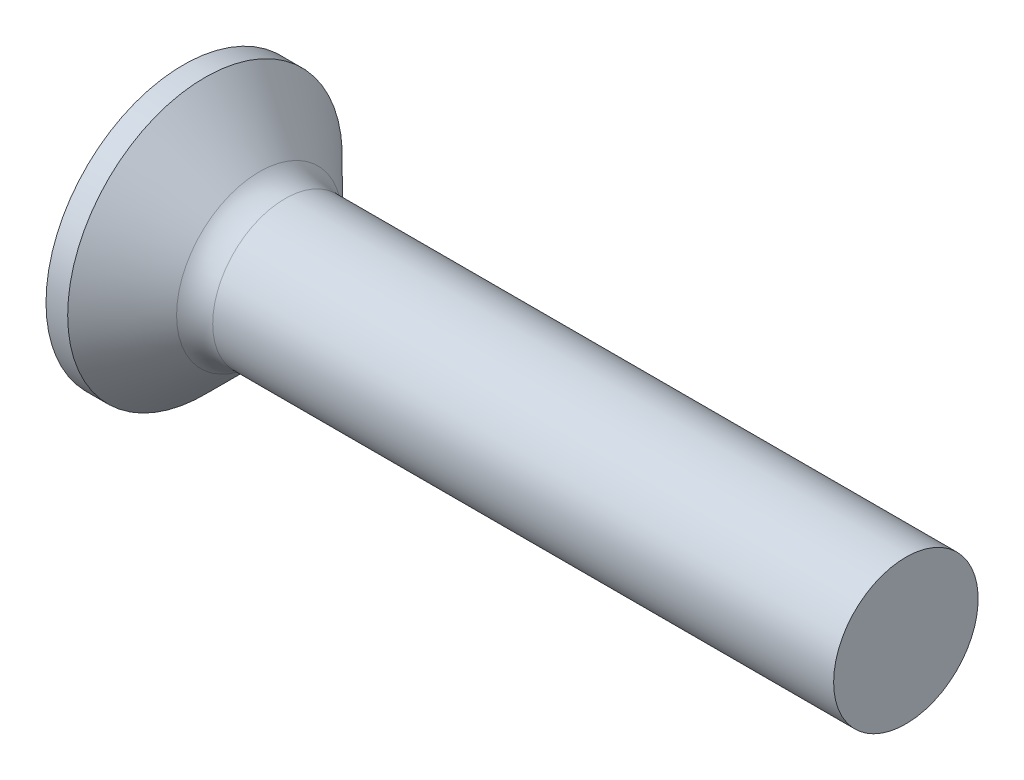
ISO-10303-21;
HEADER;
FILE_DESCRIPTION(('STEP AP214'),'2;1');
FILE_NAME('part.step','',(''),(''),'','','');
FILE_SCHEMA(('AUTOMOTIVE_DESIGN { 1 0 10303 214 1 1 1 1 }'));
ENDSEC;
DATA;
#1=APPLICATION_CONTEXT('core data for automotive mechanical design processes');
#2=APPLICATION_PROTOCOL_DEFINITION('international standard','automotive_design',2000,#1);
#3=PRODUCT_CONTEXT('',#1,'mechanical');
#4=PRODUCT('Part','Part','',(#3));
#5=PRODUCT_RELATED_PRODUCT_CATEGORY('part','',(#4));
#6=PRODUCT_DEFINITION_FORMATION('','',#4);
#7=PRODUCT_DEFINITION_CONTEXT('part definition',#1,'design');
#8=PRODUCT_DEFINITION('design','',#6,#7);
#9=PRODUCT_DEFINITION_SHAPE('','',#8);
#10=(LENGTH_UNIT() NAMED_UNIT(*) SI_UNIT(.MILLI.,.METRE.));
#11=(NAMED_UNIT(*) PLANE_ANGLE_UNIT() SI_UNIT($,.RADIAN.));
#12=(NAMED_UNIT(*) SI_UNIT($,.STERADIAN.) SOLID_ANGLE_UNIT());
#13=UNCERTAINTY_MEASURE_WITH_UNIT(LENGTH_MEASURE(1.E-05),#10,'distance_accuracy_value','');
#14=(GEOMETRIC_REPRESENTATION_CONTEXT(3) GLOBAL_UNCERTAINTY_ASSIGNED_CONTEXT((#13)) GLOBAL_UNIT_ASSIGNED_CONTEXT((#10,
#11,#12)) REPRESENTATION_CONTEXT('',''));
#15=CARTESIAN_POINT('',(0.,0.,0.));
#16=DIRECTION('',(0.,0.,1.));
#17=DIRECTION('',(1.,0.,0.));
#18=AXIS2_PLACEMENT_3D('',#15,#16,#17);
#19=CARTESIAN_POINT('',(3.86,0.,0.));
#20=DIRECTION('',(-1.,0.,0.));
#21=DIRECTION('',(0.,-1.,0.));
#22=AXIS2_PLACEMENT_3D('',#19,#20,#21);
#23=SPHERICAL_SURFACE('',#22,3.86);
#24=CARTESIAN_POINT('',(0.5,0.,0.));
#25=DIRECTION('',(-1.,0.,0.));
#26=DIRECTION('',(0.,0.,1.));
#27=AXIS2_PLACEMENT_3D('',#24,#25,#26);
#28=CIRCLE('',#27,1.9);
#29=CARTESIAN_POINT('',(0.5,0.,1.9));
#30=VERTEX_POINT('',#29);
#31=EDGE_CURVE('E203',#30,#30,#28,.T.);
#32=ORIENTED_EDGE('',*,*,#31,.T.);
#33=EDGE_LOOP('',(#32));
#34=FACE_BOUND('',#33,.T.);
#35=CARTESIAN_POINT('',(3.86,0.24,0.));
#36=DIRECTION('',(0.,-1.,0.));
#37=DIRECTION('',(0.,0.,-1.));
#38=AXIS2_PLACEMENT_3D('',#35,#36,#37);
#39=CIRCLE('',#38,3.85253163517186);
#40=CARTESIAN_POINT('',(0.146822411796274,0.240000000000004,-1.02679705807017));
#41=VERTEX_POINT('',#40);
#42=CARTESIAN_POINT('',(0.0265018969870023,0.240000000000001,-0.382481756683564));
#43=VERTEX_POINT('',#42);
#44=EDGE_CURVE('E283',#41,#43,#39,.F.);
#45=ORIENTED_EDGE('',*,*,#44,.T.);
#46=CARTESIAN_POINT('',(0.026501896987002,0.,0.));
#47=DIRECTION('',(1.,0.,0.));
#48=DIRECTION('',(0.,0.,-1.));
#49=AXIS2_PLACEMENT_3D('',#46,#47,#48);
#50=CIRCLE('',#49,0.451544343554147);
#51=CARTESIAN_POINT('',(0.026501896987002,0.382481756683564,-0.24));
#52=VERTEX_POINT('',#51);
#53=EDGE_CURVE('E312',#43,#52,#50,.T.);
#54=ORIENTED_EDGE('',*,*,#53,.T.);
#55=CARTESIAN_POINT('',(3.86,0.,-0.24));
#56=DIRECTION('',(0.,0.,1.));
#57=DIRECTION('',(1.,0.,0.));
#58=AXIS2_PLACEMENT_3D('',#55,#56,#57);
#59=CIRCLE('',#58,3.85253163517186);
#60=CARTESIAN_POINT('',(0.146822411796273,1.02679705807017,-0.24));
#61=VERTEX_POINT('',#60);
#62=EDGE_CURVE('E225',#52,#61,#59,.F.);
#63=ORIENTED_EDGE('',*,*,#62,.T.);
#64=CARTESIAN_POINT('',(3.5307526868626,-0.66036805786594,0.));
#65=DIRECTION('',(0.446197753347436,0.894934391398443,0.));
#66=DIRECTION('',(-0.894934391398443,0.446197753347436,0.));
#67=AXIS2_PLACEMENT_3D('',#64,#65,#66);
#68=CIRCLE('',#67,3.78881382954377);
#69=CARTESIAN_POINT('',(0.146822411796273,1.02679705807017,0.24));
#70=VERTEX_POINT('',#69);
#71=EDGE_CURVE('E229',#70,#61,#68,.F.);
#72=ORIENTED_EDGE('',*,*,#71,.F.);
#73=CARTESIAN_POINT('',(3.86,0.,0.240000000000001));
#74=DIRECTION('',(0.,0.,-1.));
#75=DIRECTION('',(-1.,0.,0.));
#76=AXIS2_PLACEMENT_3D('',#73,#74,#75);
#77=CIRCLE('',#76,3.85253163517186);
#78=CARTESIAN_POINT('',(0.026501896987002,0.382481756683564,0.239999999999999));
#79=VERTEX_POINT('',#78);
#80=EDGE_CURVE('E222',#70,#79,#77,.F.);
#81=ORIENTED_EDGE('',*,*,#80,.T.);
#82=CARTESIAN_POINT('',(0.026501896987002,0.239999999999999,0.382481756683566));
#83=VERTEX_POINT('',#82);
#84=EDGE_CURVE('E368',#79,#83,#50,.T.);
#85=ORIENTED_EDGE('',*,*,#84,.T.);
#86=CARTESIAN_POINT('',(0.146822411796273,0.239999999999996,1.02679705807017));
#87=VERTEX_POINT('',#86);
#88=EDGE_CURVE('E250',#83,#87,#39,.F.);
#89=ORIENTED_EDGE('',*,*,#88,.T.);
#90=CARTESIAN_POINT('',(3.5307526868626,0.,-0.66036805786594));
#91=DIRECTION('',(0.446197753347436,0.,0.894934391398443));
#92=DIRECTION('',(0.894934391398443,0.,-0.446197753347436));
#93=AXIS2_PLACEMENT_3D('',#90,#91,#92);
#94=CIRCLE('',#93,3.78881382954377);
#95=CARTESIAN_POINT('',(0.146822411796273,-0.240000000000004,1.02679705807017));
#96=VERTEX_POINT('',#95);
#97=EDGE_CURVE('E47',#96,#87,#94,.F.);
#98=ORIENTED_EDGE('',*,*,#97,.F.);
#99=CARTESIAN_POINT('',(3.86,-0.240000000000001,0.));
#100=DIRECTION('',(0.,1.,0.));
#101=DIRECTION('',(0.,0.,1.));
#102=AXIS2_PLACEMENT_3D('',#99,#100,#101);
#103=CIRCLE('',#102,3.85253163517186);
#104=CARTESIAN_POINT('',(0.0265018969870024,-0.24,0.382481756683564));
#105=VERTEX_POINT('',#104);
#106=EDGE_CURVE('E253',#96,#105,#103,.F.);
#107=ORIENTED_EDGE('',*,*,#106,.T.);
#108=CARTESIAN_POINT('',(0.026501896987002,-0.382481756683564,0.239999999999999));
#109=VERTEX_POINT('',#108);
#110=EDGE_CURVE('E338',#105,#109,#50,.T.);
#111=ORIENTED_EDGE('',*,*,#110,.T.);
#112=CARTESIAN_POINT('',(0.146822411796274,-1.02679705807017,0.239999999999999));
#113=VERTEX_POINT('',#112);
#114=EDGE_CURVE('E221',#109,#113,#77,.F.);
#115=ORIENTED_EDGE('',*,*,#114,.T.);
#116=CARTESIAN_POINT('',(3.5307526868626,0.660368057865941,0.));
#117=DIRECTION('',(0.446197753347436,-0.894934391398443,0.));
#118=DIRECTION('',(0.894934391398443,0.446197753347436,0.));
#119=AXIS2_PLACEMENT_3D('',#116,#117,#118);
#120=CIRCLE('',#119,3.78881382954377);
#121=CARTESIAN_POINT('',(0.146822411796274,-1.02679705807017,-0.24));
#122=VERTEX_POINT('',#121);
#123=EDGE_CURVE('E219',#122,#113,#120,.F.);
#124=ORIENTED_EDGE('',*,*,#123,.F.);
#125=CARTESIAN_POINT('',(0.026501896987002,-0.382481756683564,-0.24));
#126=VERTEX_POINT('',#125);
#127=EDGE_CURVE('E226',#122,#126,#59,.F.);
#128=ORIENTED_EDGE('',*,*,#127,.T.);
#129=CARTESIAN_POINT('',(0.0265018969870021,-0.239999999999998,-0.382481756683566));
#130=VERTEX_POINT('',#129);
#131=EDGE_CURVE('E333',#126,#130,#50,.T.);
#132=ORIENTED_EDGE('',*,*,#131,.T.);
#133=CARTESIAN_POINT('',(0.146822411796274,-0.239999999999996,-1.02679705807017));
#134=VERTEX_POINT('',#133);
#135=EDGE_CURVE('E255',#130,#134,#103,.F.);
#136=ORIENTED_EDGE('',*,*,#135,.T.);
#137=CARTESIAN_POINT('',(3.5307526868626,0.,0.660368057865941));
#138=DIRECTION('',(0.446197753347436,0.,-0.894934391398443));
#139=DIRECTION('',(-0.894934391398443,0.,-0.446197753347436));
#140=AXIS2_PLACEMENT_3D('',#137,#138,#139);
#141=CIRCLE('',#140,3.78881382954377);
#142=EDGE_CURVE('E232',#41,#134,#141,.F.);
#143=ORIENTED_EDGE('',*,*,#142,.F.);
#144=EDGE_LOOP('',(#45,#54,#63,#72,#81,#85,#89,#98,#107,#111,#115,#124,#128,#132,#136,#143));
#145=FACE_BOUND('',#144,.T.);
#146=ADVANCED_FACE('F34',(#34,#145),#23,.T.);
#147=CARTESIAN_POINT('',(1.4,0.401985865455145,-0.24));
#148=DIRECTION('',(0.,0.,1.));
#149=DIRECTION('',(1.,0.,0.));
#150=AXIS2_PLACEMENT_3D('',#147,#148,#149);
#151=PLANE('',#150);
#152=ORIENTED_EDGE('',*,*,#62,.F.);
#153=CARTESIAN_POINT('',(-0.630141421201685,0.435738180893799,-0.24));
#154=CARTESIAN_POINT('',(-0.493439683995462,0.424821227639115,-0.24));
#155=CARTESIAN_POINT('',(-0.356744832404071,0.413816541048482,-0.24));
#156=CARTESIAN_POINT('',(-0.0833718480972336,0.391565005762596,-0.24));
#157=CARTESIAN_POINT('',(0.0533062841867213,0.380318151771516,-0.24));
#158=CARTESIAN_POINT('',(0.326636829856237,0.357516063970467,-0.24));
#159=CARTESIAN_POINT('',(0.463289243254348,0.345960830311369,-0.24));
#160=CARTESIAN_POINT('',(0.736556437737143,0.322435777457089,-0.24));
#161=CARTESIAN_POINT('',(0.873171219358722,0.31046596452237,-0.24));
#162=CARTESIAN_POINT('',(1.11658706701548,0.288617446092617,-0.24));
#163=CARTESIAN_POINT('',(1.22339819430042,0.278851401146576,-0.24));
#164=CARTESIAN_POINT('',(1.43697328860294,0.258829193938428,-0.24));
#165=CARTESIAN_POINT('',(1.54373725613298,0.24857303714143,-0.24));
#166=CARTESIAN_POINT('',(1.75720709921717,0.227385150156522,-0.24));
#167=CARTESIAN_POINT('',(1.86391297019258,0.216453372828828,-0.24));
#168=CARTESIAN_POINT('',(2.07720550122639,0.193449095076588,-0.24));
#169=CARTESIAN_POINT('',(2.18379215593625,0.181376545397716,-0.24));
#170=CARTESIAN_POINT('',(2.29028776224271,0.168501153900596,-0.24));
#171=B_SPLINE_CURVE_WITH_KNOTS('',3,(#153,#154,#155,#156,#157,#158,#159,#160,#161,#162,#163,
#164,#165,#166,#167,#168,#169,#170),.UNSPECIFIED.,.F.,.F.,(4,2,2,2,2,2,2,2,4),(0.,
0.411411022403845,0.82283105088469,1.23425087808442,1.64566449523568,1.9674335555438,
2.2891990287258,2.61098697771399,2.93278882666852),.UNSPECIFIED.);
#172=CARTESIAN_POINT('',(1.4,0.262259890185288,-0.239999999999999));
#173=VERTEX_POINT('',#172);
#174=EDGE_CURVE('E358',#52,#173,#171,.T.);
#175=ORIENTED_EDGE('',*,*,#174,.T.);
#176=DIRECTION('',(0.,1.,0.));
#177=VECTOR('',#176,1.);
#178=CARTESIAN_POINT('',(1.4,-0.401985865455145,-0.24));
#179=LINE('',#178,#177);
#180=CARTESIAN_POINT('',(1.4,0.401985865455145,-0.24));
#181=VERTEX_POINT('',#180);
#182=EDGE_CURVE('E303',#173,#181,#179,.T.);
#183=ORIENTED_EDGE('',*,*,#182,.T.);
#184=DIRECTION('',(0.894934391398443,-0.446197753347436,0.));
#185=VECTOR('',#184,1.);
#186=CARTESIAN_POINT('',(0.,1.1,-0.24));
#187=LINE('',#186,#185);
#188=EDGE_CURVE('E200',#61,#181,#187,.T.);
#189=ORIENTED_EDGE('',*,*,#188,.F.);
#190=EDGE_LOOP('',(#152,#175,#183,#189));
#191=FACE_BOUND('',#190,.T.);
#192=ADVANCED_FACE('F168',(#191),#151,.T.);
#193=CARTESIAN_POINT('',(1.4,-0.401985865455145,-0.24));
#194=VERTEX_POINT('',#193);
#195=CARTESIAN_POINT('',(1.4,-0.262259890185288,-0.239999999999999));
#196=VERTEX_POINT('',#195);
#197=EDGE_CURVE('E209',#194,#196,#179,.T.);
#198=ORIENTED_EDGE('',*,*,#197,.T.);
#199=CARTESIAN_POINT('',(-0.630141421201685,-0.435738180893799,-0.24));
#200=CARTESIAN_POINT('',(-0.493439683995462,-0.424821227639115,-0.24));
#201=CARTESIAN_POINT('',(-0.356744832404072,-0.413816541048483,-0.24));
#202=CARTESIAN_POINT('',(-0.0833718480972338,-0.391565005762596,-0.24));
#203=CARTESIAN_POINT('',(0.0533062841867213,-0.380318151771516,-0.24));
#204=CARTESIAN_POINT('',(0.326636829856237,-0.357516063970467,-0.24));
#205=CARTESIAN_POINT('',(0.463289243254348,-0.34596083031137,-0.24));
#206=CARTESIAN_POINT('',(0.736556437737143,-0.322435777457089,-0.24));
#207=CARTESIAN_POINT('',(0.873171219358722,-0.31046596452237,-0.24));
#208=CARTESIAN_POINT('',(1.11658706701548,-0.288617446092617,-0.24));
#209=CARTESIAN_POINT('',(1.22339819430043,-0.278851401146576,-0.24));
#210=CARTESIAN_POINT('',(1.43697328860294,-0.258829193938428,-0.24));
#211=CARTESIAN_POINT('',(1.54373725613298,-0.24857303714143,-0.24));
#212=CARTESIAN_POINT('',(1.75720709921717,-0.227385150156522,-0.24));
#213=CARTESIAN_POINT('',(1.86391297019258,-0.216453372828828,-0.24));
#214=CARTESIAN_POINT('',(2.07720550122639,-0.193449095076588,-0.24));
#215=CARTESIAN_POINT('',(2.18379215593625,-0.181376545397716,-0.24));
#216=CARTESIAN_POINT('',(2.29028776224271,-0.168501153900596,-0.24));
#217=B_SPLINE_CURVE_WITH_KNOTS('',3,(#199,#200,#201,#202,#203,#204,#205,#206,#207,#208,#209,
#210,#211,#212,#213,#214,#215,#216),.UNSPECIFIED.,.F.,.F.,(4,2,2,2,2,2,2,2,4),(0.,
0.411411022403845,0.82283105088469,1.23425087808442,1.64566449523568,1.9674335555438,
2.2891990287258,2.61098697771399,2.93278882666852),.UNSPECIFIED.);
#218=EDGE_CURVE('E337',#196,#126,#217,.F.);
#219=ORIENTED_EDGE('',*,*,#218,.T.);
#220=ORIENTED_EDGE('',*,*,#127,.F.);
#221=DIRECTION('',(0.894934391398442,0.446197753347436,0.));
#222=VECTOR('',#221,1.);
#223=CARTESIAN_POINT('',(0.,-1.1,-0.24));
#224=LINE('',#223,#222);
#225=EDGE_CURVE('E62',#122,#194,#224,.T.);
#226=ORIENTED_EDGE('',*,*,#225,.T.);
#227=EDGE_LOOP('',(#198,#219,#220,#226));
#228=FACE_BOUND('',#227,.T.);
#229=ADVANCED_FACE('F174',(#228),#151,.T.);
#230=CARTESIAN_POINT('',(1.4,-0.401985865455145,0.24));
#231=DIRECTION('',(0.,0.,-1.));
#232=DIRECTION('',(-1.,0.,0.));
#233=AXIS2_PLACEMENT_3D('',#230,#231,#232);
#234=PLANE('',#233);
#235=DIRECTION('',(0.,-1.,0.));
#236=VECTOR('',#235,1.);
#237=CARTESIAN_POINT('',(1.4,0.401985865455146,0.24));
#238=LINE('',#237,#236);
#239=CARTESIAN_POINT('',(1.4,0.401985865455146,0.24));
#240=VERTEX_POINT('',#239);
#241=CARTESIAN_POINT('',(1.4,0.262259890185288,0.239999999999999));
#242=VERTEX_POINT('',#241);
#243=EDGE_CURVE('E293',#240,#242,#238,.T.);
#244=ORIENTED_EDGE('',*,*,#243,.T.);
#245=CARTESIAN_POINT('',(-0.630141421201685,0.435738180893799,0.239999999999999));
#246=CARTESIAN_POINT('',(-0.493439683995462,0.424821227639116,0.239999999999999));
#247=CARTESIAN_POINT('',(-0.356744832404071,0.413816541048483,0.239999999999999));
#248=CARTESIAN_POINT('',(-0.0833718480972334,0.391565005762596,0.239999999999999));
#249=CARTESIAN_POINT('',(0.0533062841867215,0.380318151771517,0.239999999999999));
#250=CARTESIAN_POINT('',(0.326636829856237,0.357516063970467,0.239999999999999));
#251=CARTESIAN_POINT('',(0.463289243254348,0.34596083031137,0.239999999999999));
#252=CARTESIAN_POINT('',(0.736556437737143,0.322435777457089,0.239999999999999));
#253=CARTESIAN_POINT('',(0.873171219358722,0.31046596452237,0.239999999999999));
#254=CARTESIAN_POINT('',(1.11658706701548,0.288617446092617,0.24));
#255=CARTESIAN_POINT('',(1.22339819430042,0.278851401146576,0.24));
#256=CARTESIAN_POINT('',(1.43697328860294,0.258829193938428,0.24));
#257=CARTESIAN_POINT('',(1.54373725613298,0.248573037141431,0.24));
#258=CARTESIAN_POINT('',(1.75720709921717,0.227385150156522,0.24));
#259=CARTESIAN_POINT('',(1.86391297019258,0.216453372828828,0.24));
#260=CARTESIAN_POINT('',(2.07720550122639,0.193449095076588,0.24));
#261=CARTESIAN_POINT('',(2.18379215593625,0.181376545397716,0.24));
#262=CARTESIAN_POINT('',(2.29028776224271,0.168501153900595,0.24));
#263=B_SPLINE_CURVE_WITH_KNOTS('',3,(#245,#246,#247,#248,#249,#250,#251,#252,#253,#254,#255,
#256,#257,#258,#259,#260,#261,#262),.UNSPECIFIED.,.F.,.F.,(4,2,2,2,2,2,2,2,4),(0.,
0.411411022403845,0.82283105088469,1.23425087808442,1.64566449523568,1.9674335555438,
2.2891990287258,2.61098697771399,2.93278882666852),.UNSPECIFIED.);
#264=EDGE_CURVE('E369',#242,#79,#263,.F.);
#265=ORIENTED_EDGE('',*,*,#264,.T.);
#266=ORIENTED_EDGE('',*,*,#80,.F.);
#267=DIRECTION('',(0.894934391398443,-0.446197753347436,0.));
#268=VECTOR('',#267,1.);
#269=CARTESIAN_POINT('',(0.,1.1,0.24));
#270=LINE('',#269,#268);
#271=EDGE_CURVE('E206',#70,#240,#270,.T.);
#272=ORIENTED_EDGE('',*,*,#271,.T.);
#273=EDGE_LOOP('',(#244,#265,#266,#272));
#274=FACE_BOUND('',#273,.T.);
#275=ADVANCED_FACE('F354',(#274),#234,.T.);
#276=ORIENTED_EDGE('',*,*,#114,.F.);
#277=CARTESIAN_POINT('',(-0.630141421201685,-0.435738180893799,0.239999999999999));
#278=CARTESIAN_POINT('',(-0.493439683995462,-0.424821227639116,0.239999999999999));
#279=CARTESIAN_POINT('',(-0.356744832404071,-0.413816541048483,0.239999999999999));
#280=CARTESIAN_POINT('',(-0.0833718480972336,-0.391565005762596,0.239999999999999));
#281=CARTESIAN_POINT('',(0.0533062841867214,-0.380318151771517,0.239999999999999));
#282=CARTESIAN_POINT('',(0.326636829856237,-0.357516063970467,0.239999999999999));
#283=CARTESIAN_POINT('',(0.463289243254348,-0.34596083031137,0.239999999999999));
#284=CARTESIAN_POINT('',(0.736556437737143,-0.322435777457089,0.239999999999999));
#285=CARTESIAN_POINT('',(0.873171219358722,-0.31046596452237,0.239999999999999));
#286=CARTESIAN_POINT('',(1.11658706701548,-0.288617446092617,0.24));
#287=CARTESIAN_POINT('',(1.22339819430042,-0.278851401146576,0.24));
#288=CARTESIAN_POINT('',(1.43697328860294,-0.258829193938428,0.24));
#289=CARTESIAN_POINT('',(1.54373725613298,-0.248573037141431,0.24));
#290=CARTESIAN_POINT('',(1.75720709921717,-0.227385150156522,0.24));
#291=CARTESIAN_POINT('',(1.86391297019258,-0.216453372828828,0.24));
#292=CARTESIAN_POINT('',(2.07720550122639,-0.193449095076588,0.24));
#293=CARTESIAN_POINT('',(2.18379215593625,-0.181376545397716,0.24));
#294=CARTESIAN_POINT('',(2.29028776224271,-0.168501153900596,0.24));
#295=B_SPLINE_CURVE_WITH_KNOTS('',3,(#277,#278,#279,#280,#281,#282,#283,#284,#285,#286,#287,
#288,#289,#290,#291,#292,#293,#294),.UNSPECIFIED.,.F.,.F.,(4,2,2,2,2,2,2,2,4),(0.,
0.411411022403845,0.82283105088469,1.23425087808442,1.64566449523568,1.9674335555438,
2.2891990287258,2.61098697771399,2.93278882666852),.UNSPECIFIED.);
#296=CARTESIAN_POINT('',(1.4,-0.262259890185288,0.239999999999999));
#297=VERTEX_POINT('',#296);
#298=EDGE_CURVE('E260',#109,#297,#295,.T.);
#299=ORIENTED_EDGE('',*,*,#298,.T.);
#300=CARTESIAN_POINT('',(1.4,-0.401985865455145,0.24));
#301=VERTEX_POINT('',#300);
#302=EDGE_CURVE('E295',#297,#301,#238,.T.);
#303=ORIENTED_EDGE('',*,*,#302,.T.);
#304=DIRECTION('',(0.894934391398442,0.446197753347436,0.));
#305=VECTOR('',#304,1.);
#306=CARTESIAN_POINT('',(0.,-1.1,0.239999999999999));
#307=LINE('',#306,#305);
#308=EDGE_CURVE('E287',#113,#301,#307,.T.);
#309=ORIENTED_EDGE('',*,*,#308,.F.);
#310=EDGE_LOOP('',(#276,#299,#303,#309));
#311=FACE_BOUND('',#310,.T.);
#312=ADVANCED_FACE('F402',(#311),#234,.T.);
#313=CARTESIAN_POINT('',(1.4,-0.401985865455145,-0.24));
#314=DIRECTION('',(1.,0.,0.));
#315=DIRECTION('',(0.,0.,-1.));
#316=AXIS2_PLACEMENT_3D('',#313,#314,#315);
#317=PLANE('',#316);
#318=CARTESIAN_POINT('',(1.4,0.,0.));
#319=DIRECTION('',(-1.,0.,0.));
#320=DIRECTION('',(0.,0.,1.));
#321=AXIS2_PLACEMENT_3D('',#318,#319,#320);
#322=CIRCLE('',#321,0.355499999999999);
#323=EDGE_CURVE('E330',#196,#297,#322,.T.);
#324=ORIENTED_EDGE('',*,*,#323,.F.);
#325=ORIENTED_EDGE('',*,*,#197,.F.);
#326=DIRECTION('',(0.,0.,1.));
#327=VECTOR('',#326,1.);
#328=CARTESIAN_POINT('',(1.4,-0.401985865455145,-0.24));
#329=LINE('',#328,#327);
#330=EDGE_CURVE('E290',#194,#301,#329,.T.);
#331=ORIENTED_EDGE('',*,*,#330,.T.);
#332=ORIENTED_EDGE('',*,*,#302,.F.);
#333=EDGE_LOOP('',(#324,#325,#331,#332));
#334=FACE_BOUND('',#333,.T.);
#335=ADVANCED_FACE('F407',(#334),#317,.F.);
#336=CARTESIAN_POINT('',(1.4,-0.240000000000001,0.262259890185287));
#337=VERTEX_POINT('',#336);
#338=CARTESIAN_POINT('',(1.4,0.239999999999999,0.262259890185289));
#339=VERTEX_POINT('',#338);
#340=EDGE_CURVE('E334',#337,#339,#322,.T.);
#341=ORIENTED_EDGE('',*,*,#340,.F.);
#342=DIRECTION('',(0.,0.,-1.));
#343=VECTOR('',#342,1.);
#344=CARTESIAN_POINT('',(1.4,-0.240000000000001,0.401985865455145));
#345=LINE('',#344,#343);
#346=CARTESIAN_POINT('',(1.4,-0.240000000000001,0.401985865455145));
#347=VERTEX_POINT('',#346);
#348=EDGE_CURVE('E274',#347,#337,#345,.T.);
#349=ORIENTED_EDGE('',*,*,#348,.F.);
#350=DIRECTION('',(0.,1.,0.));
#351=VECTOR('',#350,1.);
#352=CARTESIAN_POINT('',(1.4,-0.240000000000001,0.401985865455145));
#353=LINE('',#352,#351);
#354=CARTESIAN_POINT('',(1.4,0.239999999999999,0.401985865455146));
#355=VERTEX_POINT('',#354);
#356=EDGE_CURVE('E278',#347,#355,#353,.T.);
#357=ORIENTED_EDGE('',*,*,#356,.T.);
#358=DIRECTION('',(0.,0.,1.));
#359=VECTOR('',#358,1.);
#360=CARTESIAN_POINT('',(1.4,0.240000000000001,-0.401985865455144));
#361=LINE('',#360,#359);
#362=EDGE_CURVE('E252',#339,#355,#361,.T.);
#363=ORIENTED_EDGE('',*,*,#362,.F.);
#364=EDGE_LOOP('',(#341,#349,#357,#363));
#365=FACE_BOUND('',#364,.T.);
#366=ADVANCED_FACE('F396',(#365),#317,.F.);
#367=EDGE_CURVE('E329',#242,#173,#322,.T.);
#368=ORIENTED_EDGE('',*,*,#367,.F.);
#369=ORIENTED_EDGE('',*,*,#243,.F.);
#370=DIRECTION('',(0.,0.,-1.));
#371=VECTOR('',#370,1.);
#372=CARTESIAN_POINT('',(1.4,0.401985865455146,0.24));
#373=LINE('',#372,#371);
#374=EDGE_CURVE('E296',#240,#181,#373,.T.);
#375=ORIENTED_EDGE('',*,*,#374,.T.);
#376=ORIENTED_EDGE('',*,*,#182,.F.);
#377=EDGE_LOOP('',(#368,#369,#375,#376));
#378=FACE_BOUND('',#377,.T.);
#379=ADVANCED_FACE('F378',(#378),#317,.F.);
#380=CARTESIAN_POINT('',(1.4,-0.239999999999998,-0.401985865455146));
#381=DIRECTION('',(0.,1.,0.));
#382=DIRECTION('',(-1.,0.,0.));
#383=AXIS2_PLACEMENT_3D('',#380,#381,#382);
#384=PLANE('',#383);
#385=ORIENTED_EDGE('',*,*,#348,.T.);
#386=CARTESIAN_POINT('',(-0.630141421244813,-0.24,0.435738180897241));
#387=CARTESIAN_POINT('',(-0.493439684033802,-0.24,0.424821227642195));
#388=CARTESIAN_POINT('',(-0.356744832437624,-0.24,0.413816541051196));
#389=CARTESIAN_POINT('',(-0.0833718481212113,-0.24,0.391565005764564));
#390=CARTESIAN_POINT('',(0.0533062841675309,-0.24,0.380318151773106));
#391=CARTESIAN_POINT('',(0.326636829851742,-0.240000000000001,0.357516063970852));
#392=CARTESIAN_POINT('',(0.463289243259761,-0.240000000000001,0.345960830310919));
#393=CARTESIAN_POINT('',(0.736556437762365,-0.240000000000001,0.322435777454901));
#394=CARTESIAN_POINT('',(0.873171219393845,-0.240000000000001,0.310465964519282));
#395=CARTESIAN_POINT('',(1.1165870670605,-0.240000000000001,0.288617446088524));
#396=CARTESIAN_POINT('',(1.22339819434544,-0.240000000000001,0.278851401142426));
#397=CARTESIAN_POINT('',(1.43697328864794,-0.240000000000001,0.258829193934139));
#398=CARTESIAN_POINT('',(1.54373725617798,-0.240000000000001,0.248573037137061));
#399=CARTESIAN_POINT('',(1.75720709926215,-0.240000000000001,0.227385150151955));
#400=CARTESIAN_POINT('',(1.86391297023755,-0.240000000000001,0.216453372824144));
#401=CARTESIAN_POINT('',(2.07720550127133,-0.240000000000001,0.193449095071589));
#402=CARTESIAN_POINT('',(2.18379215598117,-0.240000000000001,0.181376545392517));
#403=CARTESIAN_POINT('',(2.2902877622876,-0.240000000000001,0.168501153895132));
#404=B_SPLINE_CURVE_WITH_KNOTS('',3,(#386,#387,#388,#389,#390,#391,#392,#393,#394,#395,#396,
#397,#398,#399,#400,#401,#402,#403),.UNSPECIFIED.,.F.,.F.,(4,2,2,2,2,2,2,2,4),(0.,
0.411411022418249,0.822831050913501,1.23425087814306,1.64566449532415,1.96743355563227,
2.28919902881427,2.61098697780246,2.932788826757),.UNSPECIFIED.);
#405=EDGE_CURVE('E381',#337,#105,#404,.F.);
#406=ORIENTED_EDGE('',*,*,#405,.T.);
#407=ORIENTED_EDGE('',*,*,#106,.F.);
#408=DIRECTION('',(0.894934391398443,0.,-0.446197753347436));
#409=VECTOR('',#408,1.);
#410=CARTESIAN_POINT('',(0.,-0.240000000000003,1.1));
#411=LINE('',#410,#409);
#412=EDGE_CURVE('E244',#96,#347,#411,.T.);
#413=ORIENTED_EDGE('',*,*,#412,.T.);
#414=EDGE_LOOP('',(#385,#406,#407,#413));
#415=FACE_BOUND('',#414,.T.);
#416=ADVANCED_FACE('F194',(#415),#384,.T.);
#417=CARTESIAN_POINT('',(1.4,0.239999999999999,0.401985865455146));
#418=DIRECTION('',(0.,-1.,0.));
#419=DIRECTION('',(1.,0.,0.));
#420=AXIS2_PLACEMENT_3D('',#417,#418,#419);
#421=PLANE('',#420);
#422=ORIENTED_EDGE('',*,*,#88,.F.);
#423=CARTESIAN_POINT('',(-0.630141421201685,0.239999999999998,0.435738180893799));
#424=CARTESIAN_POINT('',(-0.493439683995462,0.239999999999999,0.424821227639116));
#425=CARTESIAN_POINT('',(-0.356744832404071,0.239999999999999,0.413816541048483));
#426=CARTESIAN_POINT('',(-0.0833718480972333,0.239999999999999,0.391565005762597));
#427=CARTESIAN_POINT('',(0.0533062841867215,0.239999999999999,0.380318151771517));
#428=CARTESIAN_POINT('',(0.326636829856237,0.239999999999999,0.357516063970467));
#429=CARTESIAN_POINT('',(0.463289243254348,0.239999999999999,0.34596083031137));
#430=CARTESIAN_POINT('',(0.736556437737143,0.239999999999999,0.32243577745709));
#431=CARTESIAN_POINT('',(0.873171219358722,0.239999999999999,0.310465964522371));
#432=CARTESIAN_POINT('',(1.11658706701548,0.239999999999999,0.288617446092617));
#433=CARTESIAN_POINT('',(1.22339819430042,0.239999999999999,0.278851401146577));
#434=CARTESIAN_POINT('',(1.43697328860294,0.239999999999999,0.258829193938429));
#435=CARTESIAN_POINT('',(1.54373725613298,0.239999999999999,0.248573037141431));
#436=CARTESIAN_POINT('',(1.75720709921717,0.239999999999999,0.227385150156523));
#437=CARTESIAN_POINT('',(1.86391297019258,0.239999999999999,0.216453372828828));
#438=CARTESIAN_POINT('',(2.07720550122639,0.239999999999999,0.193449095076589));
#439=CARTESIAN_POINT('',(2.18379215593625,0.239999999999999,0.181376545397717));
#440=CARTESIAN_POINT('',(2.29028776224271,0.239999999999999,0.168501153900597));
#441=B_SPLINE_CURVE_WITH_KNOTS('',3,(#423,#424,#425,#426,#427,#428,#429,#430,#431,#432,#433,
#434,#435,#436,#437,#438,#439,#440),.UNSPECIFIED.,.F.,.F.,(4,2,2,2,2,2,2,2,4),(0.,
0.411411022403845,0.82283105088469,1.23425087808442,1.64566449523568,1.9674335555438,
2.2891990287258,2.61098697771399,2.93278882666852),.UNSPECIFIED.);
#442=EDGE_CURVE('E363',#83,#339,#441,.T.);
#443=ORIENTED_EDGE('',*,*,#442,.T.);
#444=ORIENTED_EDGE('',*,*,#362,.T.);
#445=DIRECTION('',(0.894934391398443,0.,-0.446197753347436));
#446=VECTOR('',#445,1.);
#447=CARTESIAN_POINT('',(0.,0.239999999999996,1.1));
#448=LINE('',#447,#446);
#449=EDGE_CURVE('E242',#87,#355,#448,.T.);
#450=ORIENTED_EDGE('',*,*,#449,.F.);
#451=EDGE_LOOP('',(#422,#443,#444,#450));
#452=FACE_BOUND('',#451,.T.);
#453=ADVANCED_FACE('F248',(#452),#421,.T.);
#454=CARTESIAN_POINT('',(1.4,0.240000000000001,-0.401985865455144));
#455=VERTEX_POINT('',#454);
#456=CARTESIAN_POINT('',(1.4,0.240000000000001,-0.262259890185287));
#457=VERTEX_POINT('',#456);
#458=EDGE_CURVE('E280',#455,#457,#361,.T.);
#459=ORIENTED_EDGE('',*,*,#458,.T.);
#460=CARTESIAN_POINT('',(-0.630141421201685,0.240000000000001,-0.435738180893798));
#461=CARTESIAN_POINT('',(-0.493439683995462,0.240000000000001,-0.424821227639114));
#462=CARTESIAN_POINT('',(-0.356744832404072,0.240000000000001,-0.413816541048482));
#463=CARTESIAN_POINT('',(-0.0833718480972335,0.240000000000001,-0.391565005762595));
#464=CARTESIAN_POINT('',(0.0533062841867214,0.240000000000001,-0.380318151771515));
#465=CARTESIAN_POINT('',(0.326636829856237,0.240000000000001,-0.357516063970466));
#466=CARTESIAN_POINT('',(0.463289243254348,0.240000000000001,-0.345960830311369));
#467=CARTESIAN_POINT('',(0.736556437737143,0.240000000000001,-0.322435777457088));
#468=CARTESIAN_POINT('',(0.873171219358722,0.240000000000001,-0.310465964522369));
#469=CARTESIAN_POINT('',(1.11658706701548,0.240000000000001,-0.288617446092616));
#470=CARTESIAN_POINT('',(1.22339819430042,0.240000000000001,-0.278851401146575));
#471=CARTESIAN_POINT('',(1.43697328860294,0.240000000000001,-0.258829193938427));
#472=CARTESIAN_POINT('',(1.54373725613298,0.240000000000001,-0.24857303714143));
#473=CARTESIAN_POINT('',(1.75720709921717,0.240000000000001,-0.227385150156521));
#474=CARTESIAN_POINT('',(1.86391297019258,0.240000000000001,-0.216453372828827));
#475=CARTESIAN_POINT('',(2.07720550122639,0.240000000000001,-0.193449095076587));
#476=CARTESIAN_POINT('',(2.18379215593625,0.240000000000001,-0.181376545397715));
#477=CARTESIAN_POINT('',(2.29028776224271,0.240000000000001,-0.168501153900595));
#478=B_SPLINE_CURVE_WITH_KNOTS('',3,(#460,#461,#462,#463,#464,#465,#466,#467,#468,#469,#470,
#471,#472,#473,#474,#475,#476,#477),.UNSPECIFIED.,.F.,.F.,(4,2,2,2,2,2,2,2,4),(0.,
0.411411022403845,0.82283105088469,1.23425087808442,1.64566449523568,1.9674335555438,
2.2891990287258,2.61098697771399,2.93278882666852),.UNSPECIFIED.);
#479=EDGE_CURVE('E318',#457,#43,#478,.F.);
#480=ORIENTED_EDGE('',*,*,#479,.T.);
#481=ORIENTED_EDGE('',*,*,#44,.F.);
#482=DIRECTION('',(0.894934391398442,0.,0.446197753347436));
#483=VECTOR('',#482,1.);
#484=CARTESIAN_POINT('',(0.,0.240000000000004,-1.1));
#485=LINE('',#484,#483);
#486=EDGE_CURVE('E257',#41,#455,#485,.T.);
#487=ORIENTED_EDGE('',*,*,#486,.T.);
#488=EDGE_LOOP('',(#459,#480,#481,#487));
#489=FACE_BOUND('',#488,.T.);
#490=ADVANCED_FACE('F192',(#489),#421,.T.);
#491=ORIENTED_EDGE('',*,*,#135,.F.);
#492=CARTESIAN_POINT('',(-0.630141421244813,-0.239999999999997,-0.435738180897243));
#493=CARTESIAN_POINT('',(-0.493439684033802,-0.239999999999997,-0.424821227642197));
#494=CARTESIAN_POINT('',(-0.356744832437624,-0.239999999999997,-0.413816541051198));
#495=CARTESIAN_POINT('',(-0.0833718481212114,-0.239999999999998,-0.391565005764566));
#496=CARTESIAN_POINT('',(0.0533062841675308,-0.239999999999998,-0.380318151773107));
#497=CARTESIAN_POINT('',(0.326636829851742,-0.239999999999998,-0.357516063970854));
#498=CARTESIAN_POINT('',(0.463289243259761,-0.239999999999998,-0.34596083031092));
#499=CARTESIAN_POINT('',(0.736556437762365,-0.239999999999998,-0.322435777454903));
#500=CARTESIAN_POINT('',(0.873171219393846,-0.239999999999998,-0.310465964519284));
#501=CARTESIAN_POINT('',(1.1165870670605,-0.239999999999999,-0.288617446088526));
#502=CARTESIAN_POINT('',(1.22339819434544,-0.239999999999999,-0.278851401142427));
#503=CARTESIAN_POINT('',(1.43697328864794,-0.239999999999999,-0.258829193934141));
#504=CARTESIAN_POINT('',(1.54373725617798,-0.239999999999999,-0.248573037137062));
#505=CARTESIAN_POINT('',(1.75720709926215,-0.239999999999999,-0.227385150151957));
#506=CARTESIAN_POINT('',(1.86391297023755,-0.239999999999999,-0.216453372824146));
#507=CARTESIAN_POINT('',(2.07720550127133,-0.239999999999999,-0.193449095071591));
#508=CARTESIAN_POINT('',(2.18379215598117,-0.239999999999999,-0.181376545392519));
#509=CARTESIAN_POINT('',(2.2902877622876,-0.24,-0.168501153895134));
#510=B_SPLINE_CURVE_WITH_KNOTS('',3,(#492,#493,#494,#495,#496,#497,#498,#499,#500,#501,#502,
#503,#504,#505,#506,#507,#508,#509),.UNSPECIFIED.,.F.,.F.,(4,2,2,2,2,2,2,2,4),(0.,
0.411411022418249,0.822831050913501,1.23425087814306,1.64566449532415,1.96743355563227,
2.28919902881427,2.61098697780246,2.932788826757),.UNSPECIFIED.);
#511=CARTESIAN_POINT('',(1.4,-0.239999999999999,-0.26225989018529));
#512=VERTEX_POINT('',#511);
#513=EDGE_CURVE('E11',#130,#512,#510,.T.);
#514=ORIENTED_EDGE('',*,*,#513,.T.);
#515=CARTESIAN_POINT('',(1.4,-0.239999999999998,-0.401985865455146));
#516=VERTEX_POINT('',#515);
#517=EDGE_CURVE('E277',#512,#516,#345,.T.);
#518=ORIENTED_EDGE('',*,*,#517,.T.);
#519=DIRECTION('',(0.894934391398442,0.,0.446197753347436));
#520=VECTOR('',#519,1.);
#521=CARTESIAN_POINT('',(0.,-0.239999999999995,-1.1));
#522=LINE('',#521,#520);
#523=EDGE_CURVE('E268',#134,#516,#522,.T.);
#524=ORIENTED_EDGE('',*,*,#523,.F.);
#525=EDGE_LOOP('',(#491,#514,#518,#524));
#526=FACE_BOUND('',#525,.T.);
#527=ADVANCED_FACE('F184',(#526),#384,.T.);
#528=CARTESIAN_POINT('',(10.5,0.,0.));
#529=DIRECTION('',(-1.,0.,0.));
#530=DIRECTION('',(0.,0.,1.));
#531=AXIS2_PLACEMENT_3D('',#528,#529,#530);
#532=PLANE('',#531);
#533=CARTESIAN_POINT('',(10.5,0.,0.));
#534=DIRECTION('',(-1.,0.,0.));
#535=DIRECTION('',(0.,0.,1.));
#536=AXIS2_PLACEMENT_3D('',#533,#534,#535);
#537=CIRCLE('',#536,1.);
#538=CARTESIAN_POINT('',(10.5,0.,1.));
#539=VERTEX_POINT('',#538);
#540=EDGE_CURVE('E197',#539,#539,#537,.T.);
#541=ORIENTED_EDGE('',*,*,#540,.F.);
#542=EDGE_LOOP('',(#541));
#543=FACE_BOUND('',#542,.T.);
#544=ADVANCED_FACE('F182',(#543),#532,.F.);
#545=CARTESIAN_POINT('',(-15.875,0.,0.));
#546=DIRECTION('',(-1.,0.,0.));
#547=DIRECTION('',(0.,0.,1.));
#548=AXIS2_PLACEMENT_3D('',#545,#546,#547);
#549=CYLINDRICAL_SURFACE('',#548,1.9);
#550=ORIENTED_EDGE('',*,*,#31,.F.);
#551=EDGE_LOOP('',(#550));
#552=FACE_BOUND('',#551,.T.);
#553=CARTESIAN_POINT('',(0.800000000000002,0.,0.));
#554=DIRECTION('',(-1.,0.,0.));
#555=DIRECTION('',(0.,0.,1.));
#556=AXIS2_PLACEMENT_3D('',#553,#554,#555);
#557=CIRCLE('',#556,1.9);
#558=CARTESIAN_POINT('',(0.800000000000002,0.,1.9));
#559=VERTEX_POINT('',#558);
#560=EDGE_CURVE('E199',#559,#559,#557,.T.);
#561=ORIENTED_EDGE('',*,*,#560,.T.);
#562=EDGE_LOOP('',(#561));
#563=FACE_BOUND('',#562,.T.);
#564=ADVANCED_FACE('F180',(#552,#563),#549,.T.);
#565=CARTESIAN_POINT('',(0.800000000000002,0.,0.));
#566=DIRECTION('',(-1.,0.,0.));
#567=DIRECTION('',(0.,0.,1.));
#568=AXIS2_PLACEMENT_3D('',#565,#566,#567);
#569=CONICAL_SURFACE('',#568,1.9,0.785398163397449);
#570=CARTESIAN_POINT('',(1.55355339059327,0.,0.));
#571=DIRECTION('',(1.,0.,0.));
#572=DIRECTION('',(0.,0.,-1.));
#573=AXIS2_PLACEMENT_3D('',#570,#571,#572);
#574=CIRCLE('',#573,1.14644660940673);
#575=CARTESIAN_POINT('',(1.55355339059327,0.,-1.14644660940673));
#576=VERTEX_POINT('',#575);
#577=EDGE_CURVE('E213',#576,#576,#574,.F.);
#578=ORIENTED_EDGE('',*,*,#577,.T.);
#579=EDGE_LOOP('',(#578));
#580=FACE_BOUND('',#579,.T.);
#581=ORIENTED_EDGE('',*,*,#560,.F.);
#582=EDGE_LOOP('',(#581));
#583=FACE_BOUND('',#582,.T.);
#584=ADVANCED_FACE('F190',(#580,#583),#569,.T.);
#585=CARTESIAN_POINT('',(-15.875,0.,0.));
#586=DIRECTION('',(-1.,0.,0.));
#587=DIRECTION('',(0.,0.,1.));
#588=AXIS2_PLACEMENT_3D('',#585,#586,#587);
#589=CYLINDRICAL_SURFACE('',#588,1.);
#590=CARTESIAN_POINT('',(1.90710678118655,0.,0.));
#591=DIRECTION('',(-1.,0.,0.));
#592=DIRECTION('',(0.,0.,1.));
#593=AXIS2_PLACEMENT_3D('',#590,#591,#592);
#594=CIRCLE('',#593,1.);
#595=CARTESIAN_POINT('',(1.90710678118655,0.,1.));
#596=VERTEX_POINT('',#595);
#597=EDGE_CURVE('E216',#596,#596,#594,.F.);
#598=ORIENTED_EDGE('',*,*,#597,.T.);
#599=EDGE_LOOP('',(#598));
#600=FACE_BOUND('',#599,.T.);
#601=ORIENTED_EDGE('',*,*,#540,.T.);
#602=EDGE_LOOP('',(#601));
#603=FACE_BOUND('',#602,.T.);
#604=ADVANCED_FACE('F448',(#600,#603),#589,.T.);
#605=CARTESIAN_POINT('',(1.90710678118655,0.,0.));
#606=DIRECTION('',(-1.,0.,0.));
#607=DIRECTION('',(0.,0.,1.));
#608=AXIS2_PLACEMENT_3D('',#605,#606,#607);
#609=TOROIDAL_SURFACE('',#608,1.5,0.5);
#610=ORIENTED_EDGE('',*,*,#597,.F.);
#611=EDGE_LOOP('',(#610));
#612=FACE_BOUND('',#611,.T.);
#613=ORIENTED_EDGE('',*,*,#577,.F.);
#614=EDGE_LOOP('',(#613));
#615=FACE_BOUND('',#614,.T.);
#616=ADVANCED_FACE('F36',(#612,#615),#609,.F.);
#617=EDGE_CURVE('E54',#457,#512,#322,.T.);
#618=ORIENTED_EDGE('',*,*,#617,.F.);
#619=ORIENTED_EDGE('',*,*,#458,.F.);
#620=DIRECTION('',(0.,-1.,0.));
#621=VECTOR('',#620,1.);
#622=CARTESIAN_POINT('',(1.4,0.240000000000001,-0.401985865455144));
#623=LINE('',#622,#621);
#624=EDGE_CURVE('E271',#455,#516,#623,.T.);
#625=ORIENTED_EDGE('',*,*,#624,.T.);
#626=ORIENTED_EDGE('',*,*,#517,.F.);
#627=EDGE_LOOP('',(#618,#619,#625,#626));
#628=FACE_BOUND('',#627,.T.);
#629=ADVANCED_FACE('F325',(#628),#317,.F.);
#630=CARTESIAN_POINT('',(1.4,0.401985865455146,0.24));
#631=DIRECTION('',(0.446197753347436,0.894934391398443,0.));
#632=DIRECTION('',(-0.894934391398443,0.446197753347436,0.));
#633=AXIS2_PLACEMENT_3D('',#630,#631,#632);
#634=PLANE('',#633);
#635=ORIENTED_EDGE('',*,*,#71,.T.);
#636=ORIENTED_EDGE('',*,*,#188,.T.);
#637=ORIENTED_EDGE('',*,*,#374,.F.);
#638=ORIENTED_EDGE('',*,*,#271,.F.);
#639=EDGE_LOOP('',(#635,#636,#637,#638));
#640=FACE_BOUND('',#639,.T.);
#641=ADVANCED_FACE('F352',(#640),#634,.F.);
#642=CARTESIAN_POINT('',(1.4,-0.401985865455145,-0.24));
#643=DIRECTION('',(0.446197753347436,-0.894934391398443,0.));
#644=DIRECTION('',(0.894934391398443,0.446197753347436,0.));
#645=AXIS2_PLACEMENT_3D('',#642,#643,#644);
#646=PLANE('',#645);
#647=ORIENTED_EDGE('',*,*,#123,.T.);
#648=ORIENTED_EDGE('',*,*,#308,.T.);
#649=ORIENTED_EDGE('',*,*,#330,.F.);
#650=ORIENTED_EDGE('',*,*,#225,.F.);
#651=EDGE_LOOP('',(#647,#648,#649,#650));
#652=FACE_BOUND('',#651,.T.);
#653=ADVANCED_FACE('F409',(#652),#646,.F.);
#654=CARTESIAN_POINT('',(1.4,-0.240000000000001,0.401985865455145));
#655=DIRECTION('',(0.446197753347436,0.,0.894934391398443));
#656=DIRECTION('',(-0.894934391398443,0.,0.446197753347436));
#657=AXIS2_PLACEMENT_3D('',#654,#655,#656);
#658=PLANE('',#657);
#659=ORIENTED_EDGE('',*,*,#97,.T.);
#660=ORIENTED_EDGE('',*,*,#449,.T.);
#661=ORIENTED_EDGE('',*,*,#356,.F.);
#662=ORIENTED_EDGE('',*,*,#412,.F.);
#663=EDGE_LOOP('',(#659,#660,#661,#662));
#664=FACE_BOUND('',#663,.T.);
#665=ADVANCED_FACE('F240',(#664),#658,.F.);
#666=CARTESIAN_POINT('',(1.4,0.240000000000001,-0.401985865455144));
#667=DIRECTION('',(0.446197753347436,0.,-0.894934391398443));
#668=DIRECTION('',(0.894934391398443,0.,0.446197753347436));
#669=AXIS2_PLACEMENT_3D('',#666,#667,#668);
#670=PLANE('',#669);
#671=ORIENTED_EDGE('',*,*,#142,.T.);
#672=ORIENTED_EDGE('',*,*,#523,.T.);
#673=ORIENTED_EDGE('',*,*,#624,.F.);
#674=ORIENTED_EDGE('',*,*,#486,.F.);
#675=EDGE_LOOP('',(#671,#672,#673,#674));
#676=FACE_BOUND('',#675,.T.);
#677=ADVANCED_FACE('F320',(#676),#670,.F.);
#678=CARTESIAN_POINT('',(1.4,0.,0.));
#679=DIRECTION('',(-1.,0.,0.));
#680=DIRECTION('',(0.,0.,1.));
#681=AXIS2_PLACEMENT_3D('',#678,#679,#680);
#682=CONICAL_SURFACE('',#681,0.355499999999999,0.069813170079766);
#683=ORIENTED_EDGE('',*,*,#110,.F.);
#684=ORIENTED_EDGE('',*,*,#405,.F.);
#685=EDGE_CURVE('E412',#297,#337,#322,.T.);
#686=ORIENTED_EDGE('',*,*,#685,.F.);
#687=ORIENTED_EDGE('',*,*,#298,.F.);
#688=EDGE_LOOP('',(#683,#684,#686,#687));
#689=FACE_BOUND('',#688,.T.);
#690=ADVANCED_FACE('F165',(#689),#682,.F.);
#691=EDGE_CURVE('E331',#339,#242,#322,.T.);
#692=ORIENTED_EDGE('',*,*,#691,.F.);
#693=ORIENTED_EDGE('',*,*,#442,.F.);
#694=ORIENTED_EDGE('',*,*,#84,.F.);
#695=ORIENTED_EDGE('',*,*,#264,.F.);
#696=EDGE_LOOP('',(#692,#693,#694,#695));
#697=FACE_BOUND('',#696,.T.);
#698=ADVANCED_FACE('F393',(#697),#682,.F.);
#699=ORIENTED_EDGE('',*,*,#53,.F.);
#700=ORIENTED_EDGE('',*,*,#479,.F.);
#701=EDGE_CURVE('E326',#173,#457,#322,.T.);
#702=ORIENTED_EDGE('',*,*,#701,.F.);
#703=ORIENTED_EDGE('',*,*,#174,.F.);
#704=EDGE_LOOP('',(#699,#700,#702,#703));
#705=FACE_BOUND('',#704,.T.);
#706=ADVANCED_FACE('F163',(#705),#682,.F.);
#707=EDGE_CURVE('E327',#512,#196,#322,.T.);
#708=ORIENTED_EDGE('',*,*,#707,.F.);
#709=ORIENTED_EDGE('',*,*,#513,.F.);
#710=ORIENTED_EDGE('',*,*,#131,.F.);
#711=ORIENTED_EDGE('',*,*,#218,.F.);
#712=EDGE_LOOP('',(#708,#709,#710,#711));
#713=FACE_BOUND('',#712,.T.);
#714=ADVANCED_FACE('F158',(#713),#682,.F.);
#715=CARTESIAN_POINT('',(1.5155089520108,0.,0.));
#716=DIRECTION('',(-1.,0.,0.));
#717=DIRECTION('',(0.,0.,1.));
#718=AXIS2_PLACEMENT_3D('',#715,#716,#717);
#719=CONICAL_SURFACE('',#718,0.,1.25663706143592);
#720=ORIENTED_EDGE('',*,*,#691,.T.);
#721=ORIENTED_EDGE('',*,*,#367,.T.);
#722=ORIENTED_EDGE('',*,*,#701,.T.);
#723=ORIENTED_EDGE('',*,*,#617,.T.);
#724=ORIENTED_EDGE('',*,*,#707,.T.);
#725=ORIENTED_EDGE('',*,*,#323,.T.);
#726=ORIENTED_EDGE('',*,*,#685,.T.);
#727=ORIENTED_EDGE('',*,*,#340,.T.);
#728=EDGE_LOOP('',(#720,#721,#722,#723,#724,#725,#726,#727));
#729=FACE_BOUND('',#728,.T.);
#730=CARTESIAN_POINT('',(1.5155089520108,0.,0.));
#731=VERTEX_POINT('',#730);
#732=VERTEX_LOOP('',#731);
#733=FACE_BOUND('',#732,.T.);
#734=ADVANCED_FACE('F156',(#729,#733),#719,.F.);
#735=CLOSED_SHELL('',(#146,#192,#229,#275,#312,#335,#366,#379,#416,#453,#490,#527,#544,#564,
#584,#604,#616,#629,#641,#653,#665,#677,#690,#698,#706,#714,#734));
#736=MANIFOLD_SOLID_BREP('B2',#735);
#737=ADVANCED_BREP_SHAPE_REPRESENTATION('',(#18,#736),#14);
#738=SHAPE_DEFINITION_REPRESENTATION(#9,#737);
ENDSEC;
END-ISO-10303-21;
